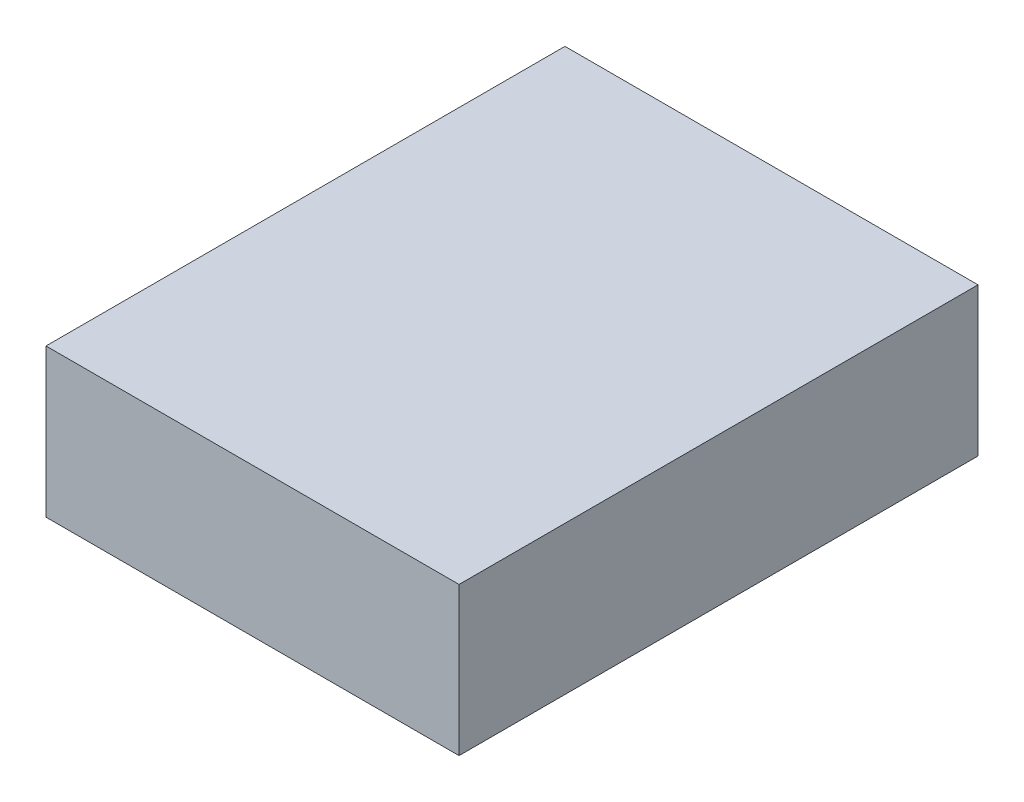
ISO-10303-21;
HEADER;
FILE_DESCRIPTION(('STEP AP214'),'2;1');
FILE_NAME('part.step','',(''),(''),'','','');
FILE_SCHEMA(('AUTOMOTIVE_DESIGN { 1 0 10303 214 1 1 1 1 }'));
ENDSEC;
DATA;
#1=APPLICATION_CONTEXT('core data for automotive mechanical design processes');
#2=APPLICATION_PROTOCOL_DEFINITION('international standard','automotive_design',2000,#1);
#3=PRODUCT_CONTEXT('',#1,'mechanical');
#4=PRODUCT('Part','Part','',(#3));
#5=PRODUCT_RELATED_PRODUCT_CATEGORY('part','',(#4));
#6=PRODUCT_DEFINITION_FORMATION('','',#4);
#7=PRODUCT_DEFINITION_CONTEXT('part definition',#1,'design');
#8=PRODUCT_DEFINITION('design','',#6,#7);
#9=PRODUCT_DEFINITION_SHAPE('','',#8);
#10=(LENGTH_UNIT() NAMED_UNIT(*) SI_UNIT(.MILLI.,.METRE.));
#11=(NAMED_UNIT(*) PLANE_ANGLE_UNIT() SI_UNIT($,.RADIAN.));
#12=(NAMED_UNIT(*) SI_UNIT($,.STERADIAN.) SOLID_ANGLE_UNIT());
#13=UNCERTAINTY_MEASURE_WITH_UNIT(LENGTH_MEASURE(1.E-05),#10,'distance_accuracy_value','');
#14=(GEOMETRIC_REPRESENTATION_CONTEXT(3) GLOBAL_UNCERTAINTY_ASSIGNED_CONTEXT((#13)) GLOBAL_UNIT_ASSIGNED_CONTEXT((#10,
#11,#12)) REPRESENTATION_CONTEXT('',''));
#15=CARTESIAN_POINT('',(0.,0.,0.));
#16=DIRECTION('',(0.,0.,1.));
#17=DIRECTION('',(1.,0.,0.));
#18=AXIS2_PLACEMENT_3D('',#15,#16,#17);
#19=CARTESIAN_POINT('',(-79.6570104067637,14.,-18.7514788045746));
#20=DIRECTION('',(1.,0.,0.));
#21=DIRECTION('',(0.,0.,-1.));
#22=AXIS2_PLACEMENT_3D('',#19,#20,#21);
#23=PLANE('',#22);
#24=DIRECTION('',(0.,0.,1.));
#25=VECTOR('',#24,1.);
#26=CARTESIAN_POINT('',(-79.6570104067637,0.,-18.7514788045746));
#27=LINE('',#26,#25);
#28=CARTESIAN_POINT('',(-79.6570104067637,0.,-18.7514788045746));
#29=VERTEX_POINT('',#28);
#30=CARTESIAN_POINT('',(-79.6570104067637,0.,30.2485211954254));
#31=VERTEX_POINT('',#30);
#32=EDGE_CURVE('E96',#29,#31,#27,.T.);
#33=ORIENTED_EDGE('',*,*,#32,.T.);
#34=DIRECTION('',(0.,-1.,0.));
#35=VECTOR('',#34,1.);
#36=CARTESIAN_POINT('',(-79.6570104067637,14.,30.2485211954254));
#37=LINE('',#36,#35);
#38=CARTESIAN_POINT('',(-79.6570104067637,14.,30.2485211954254));
#39=VERTEX_POINT('',#38);
#40=EDGE_CURVE('E11',#39,#31,#37,.T.);
#41=ORIENTED_EDGE('',*,*,#40,.F.);
#42=DIRECTION('',(0.,0.,1.));
#43=VECTOR('',#42,1.);
#44=CARTESIAN_POINT('',(-79.6570104067637,14.,-18.7514788045746));
#45=LINE('',#44,#43);
#46=CARTESIAN_POINT('',(-79.6570104067637,14.,-18.7514788045746));
#47=VERTEX_POINT('',#46);
#48=EDGE_CURVE('E84',#47,#39,#45,.T.);
#49=ORIENTED_EDGE('',*,*,#48,.F.);
#50=DIRECTION('',(0.,-1.,0.));
#51=VECTOR('',#50,1.);
#52=CARTESIAN_POINT('',(-79.6570104067637,14.,-18.7514788045746));
#53=LINE('',#52,#51);
#54=EDGE_CURVE('E92',#47,#29,#53,.T.);
#55=ORIENTED_EDGE('',*,*,#54,.T.);
#56=EDGE_LOOP('',(#33,#41,#49,#55));
#57=FACE_BOUND('',#56,.T.);
#58=ADVANCED_FACE('F33',(#57),#23,.F.);
#59=CARTESIAN_POINT('',(-79.6570104067637,14.,30.2485211954254));
#60=DIRECTION('',(0.,0.,-1.));
#61=DIRECTION('',(-1.,0.,0.));
#62=AXIS2_PLACEMENT_3D('',#59,#60,#61);
#63=PLANE('',#62);
#64=DIRECTION('',(1.,0.,0.));
#65=VECTOR('',#64,1.);
#66=CARTESIAN_POINT('',(-79.6570104067637,0.,30.2485211954254));
#67=LINE('',#66,#65);
#68=CARTESIAN_POINT('',(-40.6570104067637,0.,30.2485211954254));
#69=VERTEX_POINT('',#68);
#70=EDGE_CURVE('E88',#31,#69,#67,.T.);
#71=ORIENTED_EDGE('',*,*,#70,.T.);
#72=DIRECTION('',(0.,-1.,0.));
#73=VECTOR('',#72,1.);
#74=CARTESIAN_POINT('',(-40.6570104067637,14.,30.2485211954254));
#75=LINE('',#74,#73);
#76=CARTESIAN_POINT('',(-40.6570104067637,14.,30.2485211954254));
#77=VERTEX_POINT('',#76);
#78=EDGE_CURVE('E41',#77,#69,#75,.T.);
#79=ORIENTED_EDGE('',*,*,#78,.F.);
#80=DIRECTION('',(1.,0.,0.));
#81=VECTOR('',#80,1.);
#82=CARTESIAN_POINT('',(-79.6570104067637,14.,30.2485211954254));
#83=LINE('',#82,#81);
#84=EDGE_CURVE('E79',#39,#77,#83,.T.);
#85=ORIENTED_EDGE('',*,*,#84,.F.);
#86=ORIENTED_EDGE('',*,*,#40,.T.);
#87=EDGE_LOOP('',(#71,#79,#85,#86));
#88=FACE_BOUND('',#87,.T.);
#89=ADVANCED_FACE('F87',(#88),#63,.F.);
#90=CARTESIAN_POINT('',(-40.6570104067637,14.,-18.7514788045746));
#91=DIRECTION('',(-1.,0.,0.));
#92=DIRECTION('',(0.,0.,1.));
#93=AXIS2_PLACEMENT_3D('',#90,#91,#92);
#94=PLANE('',#93);
#95=DIRECTION('',(0.,0.,-1.));
#96=VECTOR('',#95,1.);
#97=CARTESIAN_POINT('',(-40.6570104067637,0.,-18.7514788045746));
#98=LINE('',#97,#96);
#99=CARTESIAN_POINT('',(-40.6570104067637,0.,-18.7514788045746));
#100=VERTEX_POINT('',#99);
#101=EDGE_CURVE('E66',#69,#100,#98,.T.);
#102=ORIENTED_EDGE('',*,*,#101,.T.);
#103=DIRECTION('',(0.,-1.,0.));
#104=VECTOR('',#103,1.);
#105=CARTESIAN_POINT('',(-40.6570104067637,14.,-18.7514788045746));
#106=LINE('',#105,#104);
#107=CARTESIAN_POINT('',(-40.6570104067637,14.,-18.7514788045746));
#108=VERTEX_POINT('',#107);
#109=EDGE_CURVE('E89',#108,#100,#106,.T.);
#110=ORIENTED_EDGE('',*,*,#109,.F.);
#111=DIRECTION('',(0.,0.,-1.));
#112=VECTOR('',#111,1.);
#113=CARTESIAN_POINT('',(-40.6570104067637,14.,-18.7514788045746));
#114=LINE('',#113,#112);
#115=EDGE_CURVE('E82',#77,#108,#114,.T.);
#116=ORIENTED_EDGE('',*,*,#115,.F.);
#117=ORIENTED_EDGE('',*,*,#78,.T.);
#118=EDGE_LOOP('',(#102,#110,#116,#117));
#119=FACE_BOUND('',#118,.T.);
#120=ADVANCED_FACE('F90',(#119),#94,.F.);
#121=CARTESIAN_POINT('',(-79.6570104067637,14.,-18.7514788045746));
#122=DIRECTION('',(0.,0.,1.));
#123=DIRECTION('',(1.,0.,0.));
#124=AXIS2_PLACEMENT_3D('',#121,#122,#123);
#125=PLANE('',#124);
#126=DIRECTION('',(-1.,0.,0.));
#127=VECTOR('',#126,1.);
#128=CARTESIAN_POINT('',(-79.6570104067637,0.,-18.7514788045746));
#129=LINE('',#128,#127);
#130=EDGE_CURVE('E72',#100,#29,#129,.T.);
#131=ORIENTED_EDGE('',*,*,#130,.T.);
#132=ORIENTED_EDGE('',*,*,#54,.F.);
#133=DIRECTION('',(-1.,0.,0.));
#134=VECTOR('',#133,1.);
#135=CARTESIAN_POINT('',(-79.6570104067637,14.,-18.7514788045746));
#136=LINE('',#135,#134);
#137=EDGE_CURVE('E49',#108,#47,#136,.T.);
#138=ORIENTED_EDGE('',*,*,#137,.F.);
#139=ORIENTED_EDGE('',*,*,#109,.T.);
#140=EDGE_LOOP('',(#131,#132,#138,#139));
#141=FACE_BOUND('',#140,.T.);
#142=ADVANCED_FACE('F103',(#141),#125,.F.);
#143=CARTESIAN_POINT('',(0.,14.,0.));
#144=DIRECTION('',(0.,1.,0.));
#145=DIRECTION('',(0.,0.,1.));
#146=AXIS2_PLACEMENT_3D('',#143,#144,#145);
#147=PLANE('',#146);
#148=ORIENTED_EDGE('',*,*,#48,.T.);
#149=ORIENTED_EDGE('',*,*,#84,.T.);
#150=ORIENTED_EDGE('',*,*,#115,.T.);
#151=ORIENTED_EDGE('',*,*,#137,.T.);
#152=EDGE_LOOP('',(#148,#149,#150,#151));
#153=FACE_BOUND('',#152,.T.);
#154=ADVANCED_FACE('F80',(#153),#147,.T.);
#155=CARTESIAN_POINT('',(0.,0.,0.));
#156=DIRECTION('',(0.,1.,0.));
#157=DIRECTION('',(0.,0.,1.));
#158=AXIS2_PLACEMENT_3D('',#155,#156,#157);
#159=PLANE('',#158);
#160=ORIENTED_EDGE('',*,*,#32,.F.);
#161=ORIENTED_EDGE('',*,*,#130,.F.);
#162=ORIENTED_EDGE('',*,*,#101,.F.);
#163=ORIENTED_EDGE('',*,*,#70,.F.);
#164=EDGE_LOOP('',(#160,#161,#162,#163));
#165=FACE_BOUND('',#164,.T.);
#166=ADVANCED_FACE('F106',(#165),#159,.F.);
#167=CLOSED_SHELL('',(#58,#89,#120,#142,#154,#166));
#168=MANIFOLD_SOLID_BREP('B2',#167);
#169=ADVANCED_BREP_SHAPE_REPRESENTATION('',(#18,#168),#14);
#170=SHAPE_DEFINITION_REPRESENTATION(#9,#169);
ENDSEC;
END-ISO-10303-21;
